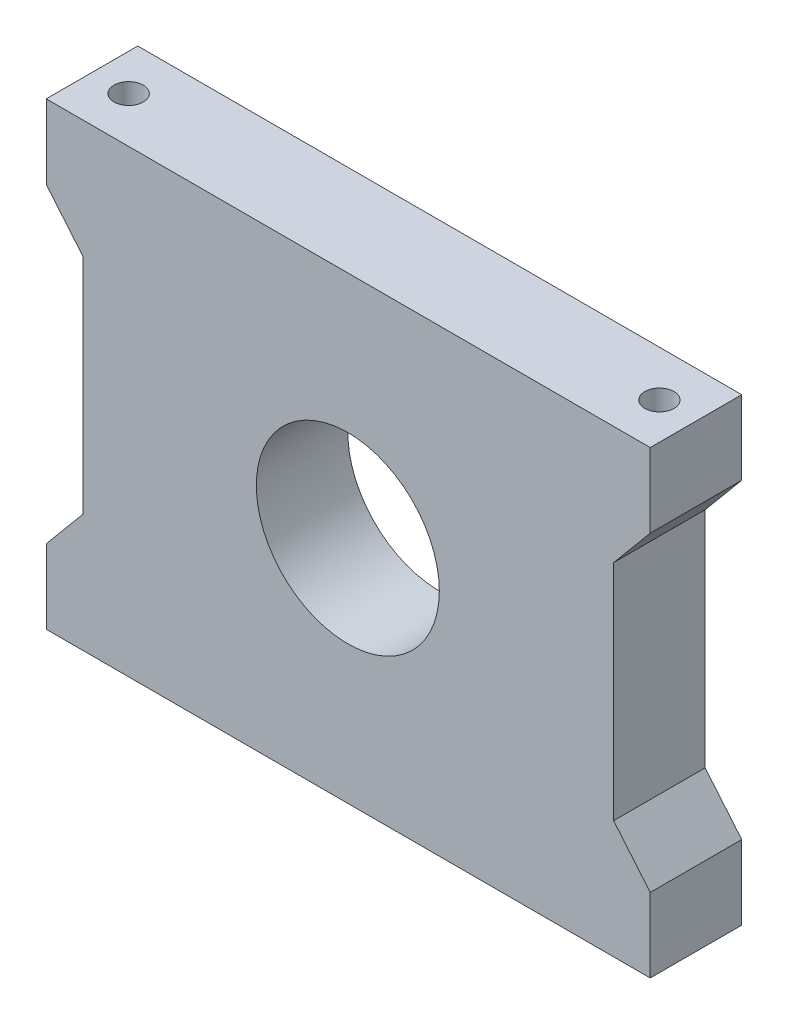
ISO-10303-21;
HEADER;
FILE_DESCRIPTION(('STEP AP214'),'2;1');
FILE_NAME('part.step','',(''),(''),'','','');
FILE_SCHEMA(('AUTOMOTIVE_DESIGN { 1 0 10303 214 1 1 1 1 }'));
ENDSEC;
DATA;
#1=APPLICATION_CONTEXT('core data for automotive mechanical design processes');
#2=APPLICATION_PROTOCOL_DEFINITION('international standard','automotive_design',2000,#1);
#3=PRODUCT_CONTEXT('',#1,'mechanical');
#4=PRODUCT('Part','Part','',(#3));
#5=PRODUCT_RELATED_PRODUCT_CATEGORY('part','',(#4));
#6=PRODUCT_DEFINITION_FORMATION('','',#4);
#7=PRODUCT_DEFINITION_CONTEXT('part definition',#1,'design');
#8=PRODUCT_DEFINITION('design','',#6,#7);
#9=PRODUCT_DEFINITION_SHAPE('','',#8);
#10=(LENGTH_UNIT() NAMED_UNIT(*) SI_UNIT(.MILLI.,.METRE.));
#11=(NAMED_UNIT(*) PLANE_ANGLE_UNIT() SI_UNIT($,.RADIAN.));
#12=(NAMED_UNIT(*) SI_UNIT($,.STERADIAN.) SOLID_ANGLE_UNIT());
#13=UNCERTAINTY_MEASURE_WITH_UNIT(LENGTH_MEASURE(1.E-05),#10,'distance_accuracy_value','');
#14=(GEOMETRIC_REPRESENTATION_CONTEXT(3) GLOBAL_UNCERTAINTY_ASSIGNED_CONTEXT((#13)) GLOBAL_UNIT_ASSIGNED_CONTEXT((#10,
#11,#12)) REPRESENTATION_CONTEXT('',''));
#15=CARTESIAN_POINT('',(0.,0.,0.));
#16=DIRECTION('',(0.,0.,1.));
#17=DIRECTION('',(1.,0.,0.));
#18=AXIS2_PLACEMENT_3D('',#15,#16,#17);
#19=CARTESIAN_POINT('',(0.,0.,10.));
#20=DIRECTION('',(0.,0.,1.));
#21=DIRECTION('',(1.,0.,0.));
#22=AXIS2_PLACEMENT_3D('',#19,#20,#21);
#23=PLANE('',#22);
#24=DIRECTION('',(0.,-1.,0.));
#25=VECTOR('',#24,1.);
#26=CARTESIAN_POINT('',(0.,0.,10.));
#27=LINE('',#26,#25);
#28=CARTESIAN_POINT('',(0.,8.1,10.));
#29=VERTEX_POINT('',#28);
#30=CARTESIAN_POINT('',(0.,0.,10.));
#31=VERTEX_POINT('',#30);
#32=EDGE_CURVE('E184',#29,#31,#27,.T.);
#33=ORIENTED_EDGE('',*,*,#32,.T.);
#34=DIRECTION('',(1.,0.,0.));
#35=VECTOR('',#34,1.);
#36=CARTESIAN_POINT('',(0.,0.,10.));
#37=LINE('',#36,#35);
#38=CARTESIAN_POINT('',(66.,0.,10.));
#39=VERTEX_POINT('',#38);
#40=EDGE_CURVE('E112',#31,#39,#37,.T.);
#41=ORIENTED_EDGE('',*,*,#40,.T.);
#42=DIRECTION('',(0.,1.,0.));
#43=VECTOR('',#42,1.);
#44=CARTESIAN_POINT('',(66.,0.,10.));
#45=LINE('',#44,#43);
#46=CARTESIAN_POINT('',(66.,8.1,10.));
#47=VERTEX_POINT('',#46);
#48=EDGE_CURVE('E211',#39,#47,#45,.T.);
#49=ORIENTED_EDGE('',*,*,#48,.T.);
#50=DIRECTION('',(-0.641215926832567,0.767360498837576,0.));
#51=VECTOR('',#50,1.);
#52=CARTESIAN_POINT('',(66.,8.1,10.));
#53=LINE('',#52,#51);
#54=CARTESIAN_POINT('',(62.,12.8869085387703,10.));
#55=VERTEX_POINT('',#54);
#56=EDGE_CURVE('E230',#47,#55,#53,.T.);
#57=ORIENTED_EDGE('',*,*,#56,.T.);
#58=DIRECTION('',(0.,1.,0.));
#59=VECTOR('',#58,1.);
#60=CARTESIAN_POINT('',(62.,12.8869085387703,10.));
#61=LINE('',#60,#59);
#62=CARTESIAN_POINT('',(62.,37.3130914612297,10.));
#63=VERTEX_POINT('',#62);
#64=EDGE_CURVE('E227',#55,#63,#61,.T.);
#65=ORIENTED_EDGE('',*,*,#64,.T.);
#66=DIRECTION('',(0.641215926832567,0.767360498837575,0.));
#67=VECTOR('',#66,1.);
#68=CARTESIAN_POINT('',(66.,42.1,10.));
#69=LINE('',#68,#67);
#70=CARTESIAN_POINT('',(66.,42.1,10.));
#71=VERTEX_POINT('',#70);
#72=EDGE_CURVE('E229',#63,#71,#69,.T.);
#73=ORIENTED_EDGE('',*,*,#72,.T.);
#74=DIRECTION('',(0.,1.,0.));
#75=VECTOR('',#74,1.);
#76=CARTESIAN_POINT('',(66.,50.2,10.));
#77=LINE('',#76,#75);
#78=CARTESIAN_POINT('',(66.,50.2,10.));
#79=VERTEX_POINT('',#78);
#80=EDGE_CURVE('E232',#71,#79,#77,.T.);
#81=ORIENTED_EDGE('',*,*,#80,.T.);
#82=DIRECTION('',(-1.,0.,0.));
#83=VECTOR('',#82,1.);
#84=CARTESIAN_POINT('',(66.,50.2,10.));
#85=LINE('',#84,#83);
#86=CARTESIAN_POINT('',(0.,50.2,10.));
#87=VERTEX_POINT('',#86);
#88=EDGE_CURVE('E238',#79,#87,#85,.T.);
#89=ORIENTED_EDGE('',*,*,#88,.T.);
#90=DIRECTION('',(0.,-1.,0.));
#91=VECTOR('',#90,1.);
#92=CARTESIAN_POINT('',(0.,50.2,10.));
#93=LINE('',#92,#91);
#94=CARTESIAN_POINT('',(0.,42.1,10.));
#95=VERTEX_POINT('',#94);
#96=EDGE_CURVE('E143',#87,#95,#93,.T.);
#97=ORIENTED_EDGE('',*,*,#96,.T.);
#98=DIRECTION('',(0.641215926832567,-0.767360498837575,0.));
#99=VECTOR('',#98,1.);
#100=CARTESIAN_POINT('',(0.,42.1,10.));
#101=LINE('',#100,#99);
#102=CARTESIAN_POINT('',(4.,37.3130914612297,10.));
#103=VERTEX_POINT('',#102);
#104=EDGE_CURVE('E137',#95,#103,#101,.T.);
#105=ORIENTED_EDGE('',*,*,#104,.T.);
#106=DIRECTION('',(0.,-1.,0.));
#107=VECTOR('',#106,1.);
#108=CARTESIAN_POINT('',(4.,12.8869085387703,10.));
#109=LINE('',#108,#107);
#110=CARTESIAN_POINT('',(4.,12.8869085387703,10.));
#111=VERTEX_POINT('',#110);
#112=EDGE_CURVE('E141',#103,#111,#109,.T.);
#113=ORIENTED_EDGE('',*,*,#112,.T.);
#114=DIRECTION('',(-0.641215926832567,-0.767360498837575,0.));
#115=VECTOR('',#114,1.);
#116=CARTESIAN_POINT('',(0.,8.1,10.));
#117=LINE('',#116,#115);
#118=EDGE_CURVE('E57',#111,#29,#117,.T.);
#119=ORIENTED_EDGE('',*,*,#118,.T.);
#120=EDGE_LOOP('',(#33,#41,#49,#57,#65,#73,#81,#89,#97,#105,#113,#119));
#121=FACE_BOUND('',#120,.T.);
#122=CARTESIAN_POINT('',(32.9524080393924,25.1,10.));
#123=DIRECTION('',(0.,0.,1.));
#124=DIRECTION('',(1.,0.,0.));
#125=AXIS2_PLACEMENT_3D('',#122,#123,#124);
#126=CIRCLE('',#125,10.);
#127=CARTESIAN_POINT('',(42.9524080393924,25.1,10.));
#128=VERTEX_POINT('',#127);
#129=EDGE_CURVE('E165',#128,#128,#126,.T.);
#130=ORIENTED_EDGE('',*,*,#129,.F.);
#131=EDGE_LOOP('',(#130));
#132=FACE_BOUND('',#131,.T.);
#133=ADVANCED_FACE('F40',(#121,#132),#23,.T.);
#134=CARTESIAN_POINT('',(0.,0.,0.));
#135=DIRECTION('',(0.,0.,1.));
#136=DIRECTION('',(1.,0.,0.));
#137=AXIS2_PLACEMENT_3D('',#134,#135,#136);
#138=PLANE('',#137);
#139=DIRECTION('',(0.,-1.,0.));
#140=VECTOR('',#139,1.);
#141=CARTESIAN_POINT('',(0.,0.,0.));
#142=LINE('',#141,#140);
#143=CARTESIAN_POINT('',(0.,8.1,0.));
#144=VERTEX_POINT('',#143);
#145=CARTESIAN_POINT('',(0.,0.,0.));
#146=VERTEX_POINT('',#145);
#147=EDGE_CURVE('E161',#144,#146,#142,.T.);
#148=ORIENTED_EDGE('',*,*,#147,.F.);
#149=DIRECTION('',(-0.641215926832567,-0.767360498837575,0.));
#150=VECTOR('',#149,1.);
#151=CARTESIAN_POINT('',(0.,8.1,0.));
#152=LINE('',#151,#150);
#153=CARTESIAN_POINT('',(4.,12.8869085387703,0.));
#154=VERTEX_POINT('',#153);
#155=EDGE_CURVE('E104',#154,#144,#152,.T.);
#156=ORIENTED_EDGE('',*,*,#155,.F.);
#157=DIRECTION('',(0.,-1.,0.));
#158=VECTOR('',#157,1.);
#159=CARTESIAN_POINT('',(4.,12.8869085387703,0.));
#160=LINE('',#159,#158);
#161=CARTESIAN_POINT('',(4.,37.3130914612297,0.));
#162=VERTEX_POINT('',#161);
#163=EDGE_CURVE('E98',#162,#154,#160,.T.);
#164=ORIENTED_EDGE('',*,*,#163,.F.);
#165=DIRECTION('',(0.641215926832567,-0.767360498837575,0.));
#166=VECTOR('',#165,1.);
#167=CARTESIAN_POINT('',(0.,42.1,0.));
#168=LINE('',#167,#166);
#169=CARTESIAN_POINT('',(0.,42.1,0.));
#170=VERTEX_POINT('',#169);
#171=EDGE_CURVE('E151',#170,#162,#168,.T.);
#172=ORIENTED_EDGE('',*,*,#171,.F.);
#173=DIRECTION('',(0.,-1.,0.));
#174=VECTOR('',#173,1.);
#175=CARTESIAN_POINT('',(0.,50.2,0.));
#176=LINE('',#175,#174);
#177=CARTESIAN_POINT('',(0.,50.2,0.));
#178=VERTEX_POINT('',#177);
#179=EDGE_CURVE('E179',#178,#170,#176,.T.);
#180=ORIENTED_EDGE('',*,*,#179,.F.);
#181=DIRECTION('',(-1.,0.,0.));
#182=VECTOR('',#181,1.);
#183=CARTESIAN_POINT('',(66.,50.2,0.));
#184=LINE('',#183,#182);
#185=CARTESIAN_POINT('',(66.,50.2,0.));
#186=VERTEX_POINT('',#185);
#187=EDGE_CURVE('E177',#186,#178,#184,.T.);
#188=ORIENTED_EDGE('',*,*,#187,.F.);
#189=DIRECTION('',(0.,1.,0.));
#190=VECTOR('',#189,1.);
#191=CARTESIAN_POINT('',(66.,50.2,0.));
#192=LINE('',#191,#190);
#193=CARTESIAN_POINT('',(66.,42.1,0.));
#194=VERTEX_POINT('',#193);
#195=EDGE_CURVE('E175',#194,#186,#192,.T.);
#196=ORIENTED_EDGE('',*,*,#195,.F.);
#197=DIRECTION('',(0.641215926832567,0.767360498837575,0.));
#198=VECTOR('',#197,1.);
#199=CARTESIAN_POINT('',(66.,42.1,0.));
#200=LINE('',#199,#198);
#201=CARTESIAN_POINT('',(62.,37.3130914612297,0.));
#202=VERTEX_POINT('',#201);
#203=EDGE_CURVE('E173',#202,#194,#200,.T.);
#204=ORIENTED_EDGE('',*,*,#203,.F.);
#205=DIRECTION('',(0.,1.,0.));
#206=VECTOR('',#205,1.);
#207=CARTESIAN_POINT('',(62.,12.8869085387703,0.));
#208=LINE('',#207,#206);
#209=CARTESIAN_POINT('',(62.,12.8869085387703,0.));
#210=VERTEX_POINT('',#209);
#211=EDGE_CURVE('E171',#210,#202,#208,.T.);
#212=ORIENTED_EDGE('',*,*,#211,.F.);
#213=DIRECTION('',(-0.641215926832567,0.767360498837576,0.));
#214=VECTOR('',#213,1.);
#215=CARTESIAN_POINT('',(66.,8.1,0.));
#216=LINE('',#215,#214);
#217=CARTESIAN_POINT('',(66.,8.1,0.));
#218=VERTEX_POINT('',#217);
#219=EDGE_CURVE('E169',#218,#210,#216,.T.);
#220=ORIENTED_EDGE('',*,*,#219,.F.);
#221=DIRECTION('',(0.,1.,0.));
#222=VECTOR('',#221,1.);
#223=CARTESIAN_POINT('',(66.,0.,0.));
#224=LINE('',#223,#222);
#225=CARTESIAN_POINT('',(66.,0.,0.));
#226=VERTEX_POINT('',#225);
#227=EDGE_CURVE('E167',#226,#218,#224,.T.);
#228=ORIENTED_EDGE('',*,*,#227,.F.);
#229=DIRECTION('',(1.,0.,0.));
#230=VECTOR('',#229,1.);
#231=CARTESIAN_POINT('',(0.,0.,0.));
#232=LINE('',#231,#230);
#233=EDGE_CURVE('E164',#146,#226,#232,.T.);
#234=ORIENTED_EDGE('',*,*,#233,.F.);
#235=EDGE_LOOP('',(#148,#156,#164,#172,#180,#188,#196,#204,#212,#220,#228,#234));
#236=FACE_BOUND('',#235,.T.);
#237=CARTESIAN_POINT('',(32.9524080393924,25.1,0.));
#238=DIRECTION('',(0.,0.,1.));
#239=DIRECTION('',(1.,0.,0.));
#240=AXIS2_PLACEMENT_3D('',#237,#238,#239);
#241=CIRCLE('',#240,10.);
#242=CARTESIAN_POINT('',(42.9524080393924,25.1,0.));
#243=VERTEX_POINT('',#242);
#244=EDGE_CURVE('E324',#243,#243,#241,.T.);
#245=ORIENTED_EDGE('',*,*,#244,.T.);
#246=EDGE_LOOP('',(#245));
#247=FACE_BOUND('',#246,.T.);
#248=ADVANCED_FACE('F215',(#236,#247),#138,.F.);
#249=CARTESIAN_POINT('',(0.,0.,10.));
#250=DIRECTION('',(1.,0.,0.));
#251=DIRECTION('',(0.,0.,-1.));
#252=AXIS2_PLACEMENT_3D('',#249,#250,#251);
#253=PLANE('',#252);
#254=ORIENTED_EDGE('',*,*,#147,.T.);
#255=DIRECTION('',(0.,0.,-1.));
#256=VECTOR('',#255,1.);
#257=CARTESIAN_POINT('',(0.,0.,10.));
#258=LINE('',#257,#256);
#259=EDGE_CURVE('E11',#31,#146,#258,.T.);
#260=ORIENTED_EDGE('',*,*,#259,.F.);
#261=ORIENTED_EDGE('',*,*,#32,.F.);
#262=DIRECTION('',(0.,0.,-1.));
#263=VECTOR('',#262,1.);
#264=CARTESIAN_POINT('',(0.,8.1,10.));
#265=LINE('',#264,#263);
#266=EDGE_CURVE('E157',#29,#144,#265,.T.);
#267=ORIENTED_EDGE('',*,*,#266,.T.);
#268=EDGE_LOOP('',(#254,#260,#261,#267));
#269=FACE_BOUND('',#268,.T.);
#270=ADVANCED_FACE('F42',(#269),#253,.F.);
#271=CARTESIAN_POINT('',(0.,0.,10.));
#272=DIRECTION('',(0.,1.,0.));
#273=DIRECTION('',(0.,0.,1.));
#274=AXIS2_PLACEMENT_3D('',#271,#272,#273);
#275=PLANE('',#274);
#276=CARTESIAN_POINT('',(4.,0.,5.));
#277=DIRECTION('',(0.,1.,0.));
#278=DIRECTION('',(0.,0.,1.));
#279=AXIS2_PLACEMENT_3D('',#276,#277,#278);
#280=CIRCLE('',#279,1.6);
#281=CARTESIAN_POINT('',(4.,0.,6.6));
#282=VERTEX_POINT('',#281);
#283=EDGE_CURVE('E307',#282,#282,#280,.T.);
#284=ORIENTED_EDGE('',*,*,#283,.T.);
#285=EDGE_LOOP('',(#284));
#286=FACE_BOUND('',#285,.T.);
#287=CARTESIAN_POINT('',(62.,0.,4.99999999999999));
#288=DIRECTION('',(0.,1.,0.));
#289=DIRECTION('',(0.,0.,-1.));
#290=AXIS2_PLACEMENT_3D('',#287,#288,#289);
#291=CIRCLE('',#290,1.60000000000001);
#292=CARTESIAN_POINT('',(62.,0.,3.39999999999999));
#293=VERTEX_POINT('',#292);
#294=EDGE_CURVE('E318',#293,#293,#291,.T.);
#295=ORIENTED_EDGE('',*,*,#294,.T.);
#296=EDGE_LOOP('',(#295));
#297=FACE_BOUND('',#296,.T.);
#298=ORIENTED_EDGE('',*,*,#233,.T.);
#299=DIRECTION('',(0.,0.,-1.));
#300=VECTOR('',#299,1.);
#301=CARTESIAN_POINT('',(66.,0.,10.));
#302=LINE('',#301,#300);
#303=EDGE_CURVE('E49',#39,#226,#302,.T.);
#304=ORIENTED_EDGE('',*,*,#303,.F.);
#305=ORIENTED_EDGE('',*,*,#40,.F.);
#306=ORIENTED_EDGE('',*,*,#259,.T.);
#307=EDGE_LOOP('',(#298,#304,#305,#306));
#308=FACE_BOUND('',#307,.T.);
#309=ADVANCED_FACE('F365',(#286,#297,#308),#275,.F.);
#310=CARTESIAN_POINT('',(66.,0.,10.));
#311=DIRECTION('',(-1.,0.,0.));
#312=DIRECTION('',(0.,0.,1.));
#313=AXIS2_PLACEMENT_3D('',#310,#311,#312);
#314=PLANE('',#313);
#315=ORIENTED_EDGE('',*,*,#227,.T.);
#316=DIRECTION('',(0.,0.,-1.));
#317=VECTOR('',#316,1.);
#318=CARTESIAN_POINT('',(66.,8.1,10.));
#319=LINE('',#318,#317);
#320=EDGE_CURVE('E203',#47,#218,#319,.T.);
#321=ORIENTED_EDGE('',*,*,#320,.F.);
#322=ORIENTED_EDGE('',*,*,#48,.F.);
#323=ORIENTED_EDGE('',*,*,#303,.T.);
#324=EDGE_LOOP('',(#315,#321,#322,#323));
#325=FACE_BOUND('',#324,.T.);
#326=ADVANCED_FACE('F209',(#325),#314,.F.);
#327=CARTESIAN_POINT('',(66.,8.1,10.));
#328=DIRECTION('',(-0.767360498837576,-0.641215926832567,0.));
#329=DIRECTION('',(0.641215926832567,-0.767360498837576,0.));
#330=AXIS2_PLACEMENT_3D('',#327,#328,#329);
#331=PLANE('',#330);
#332=ORIENTED_EDGE('',*,*,#219,.T.);
#333=DIRECTION('',(0.,0.,-1.));
#334=VECTOR('',#333,1.);
#335=CARTESIAN_POINT('',(62.,12.8869085387703,10.));
#336=LINE('',#335,#334);
#337=EDGE_CURVE('E200',#55,#210,#336,.T.);
#338=ORIENTED_EDGE('',*,*,#337,.F.);
#339=ORIENTED_EDGE('',*,*,#56,.F.);
#340=ORIENTED_EDGE('',*,*,#320,.T.);
#341=EDGE_LOOP('',(#332,#338,#339,#340));
#342=FACE_BOUND('',#341,.T.);
#343=ADVANCED_FACE('F221',(#342),#331,.F.);
#344=CARTESIAN_POINT('',(62.,12.8869085387703,10.));
#345=DIRECTION('',(-1.,0.,0.));
#346=DIRECTION('',(0.,0.,1.));
#347=AXIS2_PLACEMENT_3D('',#344,#345,#346);
#348=PLANE('',#347);
#349=ORIENTED_EDGE('',*,*,#211,.T.);
#350=DIRECTION('',(0.,0.,-1.));
#351=VECTOR('',#350,1.);
#352=CARTESIAN_POINT('',(62.,37.3130914612297,10.));
#353=LINE('',#352,#351);
#354=EDGE_CURVE('E197',#63,#202,#353,.T.);
#355=ORIENTED_EDGE('',*,*,#354,.F.);
#356=ORIENTED_EDGE('',*,*,#64,.F.);
#357=ORIENTED_EDGE('',*,*,#337,.T.);
#358=EDGE_LOOP('',(#349,#355,#356,#357));
#359=FACE_BOUND('',#358,.T.);
#360=ADVANCED_FACE('F225',(#359),#348,.F.);
#361=CARTESIAN_POINT('',(66.,42.1,10.));
#362=DIRECTION('',(-0.767360498837575,0.641215926832567,0.));
#363=DIRECTION('',(-0.641215926832567,-0.767360498837575,0.));
#364=AXIS2_PLACEMENT_3D('',#361,#362,#363);
#365=PLANE('',#364);
#366=ORIENTED_EDGE('',*,*,#203,.T.);
#367=DIRECTION('',(0.,0.,-1.));
#368=VECTOR('',#367,1.);
#369=CARTESIAN_POINT('',(66.,42.1,10.));
#370=LINE('',#369,#368);
#371=EDGE_CURVE('E194',#71,#194,#370,.T.);
#372=ORIENTED_EDGE('',*,*,#371,.F.);
#373=ORIENTED_EDGE('',*,*,#72,.F.);
#374=ORIENTED_EDGE('',*,*,#354,.T.);
#375=EDGE_LOOP('',(#366,#372,#373,#374));
#376=FACE_BOUND('',#375,.T.);
#377=ADVANCED_FACE('F351',(#376),#365,.F.);
#378=CARTESIAN_POINT('',(66.,50.2,10.));
#379=DIRECTION('',(-1.,0.,0.));
#380=DIRECTION('',(0.,0.,1.));
#381=AXIS2_PLACEMENT_3D('',#378,#379,#380);
#382=PLANE('',#381);
#383=ORIENTED_EDGE('',*,*,#195,.T.);
#384=DIRECTION('',(0.,0.,-1.));
#385=VECTOR('',#384,1.);
#386=CARTESIAN_POINT('',(66.,50.2,10.));
#387=LINE('',#386,#385);
#388=EDGE_CURVE('E191',#79,#186,#387,.T.);
#389=ORIENTED_EDGE('',*,*,#388,.F.);
#390=ORIENTED_EDGE('',*,*,#80,.F.);
#391=ORIENTED_EDGE('',*,*,#371,.T.);
#392=EDGE_LOOP('',(#383,#389,#390,#391));
#393=FACE_BOUND('',#392,.T.);
#394=ADVANCED_FACE('F343',(#393),#382,.F.);
#395=CARTESIAN_POINT('',(66.,50.2,10.));
#396=DIRECTION('',(0.,-1.,0.));
#397=DIRECTION('',(0.,0.,-1.));
#398=AXIS2_PLACEMENT_3D('',#395,#396,#397);
#399=PLANE('',#398);
#400=CARTESIAN_POINT('',(4.,50.2,5.));
#401=DIRECTION('',(0.,1.,0.));
#402=DIRECTION('',(0.,0.,1.));
#403=AXIS2_PLACEMENT_3D('',#400,#401,#402);
#404=CIRCLE('',#403,1.6);
#405=CARTESIAN_POINT('',(4.,50.2,6.6));
#406=VERTEX_POINT('',#405);
#407=EDGE_CURVE('E325',#406,#406,#404,.T.);
#408=ORIENTED_EDGE('',*,*,#407,.F.);
#409=EDGE_LOOP('',(#408));
#410=FACE_BOUND('',#409,.T.);
#411=CARTESIAN_POINT('',(62.,50.2,4.99999999999999));
#412=DIRECTION('',(0.,1.,0.));
#413=DIRECTION('',(0.,0.,-1.));
#414=AXIS2_PLACEMENT_3D('',#411,#412,#413);
#415=CIRCLE('',#414,1.60000000000001);
#416=CARTESIAN_POINT('',(62.,50.2,3.39999999999999));
#417=VERTEX_POINT('',#416);
#418=EDGE_CURVE('E306',#417,#417,#415,.T.);
#419=ORIENTED_EDGE('',*,*,#418,.F.);
#420=EDGE_LOOP('',(#419));
#421=FACE_BOUND('',#420,.T.);
#422=ORIENTED_EDGE('',*,*,#187,.T.);
#423=DIRECTION('',(0.,0.,-1.));
#424=VECTOR('',#423,1.);
#425=CARTESIAN_POINT('',(0.,50.2,10.));
#426=LINE('',#425,#424);
#427=EDGE_CURVE('E188',#87,#178,#426,.T.);
#428=ORIENTED_EDGE('',*,*,#427,.F.);
#429=ORIENTED_EDGE('',*,*,#88,.F.);
#430=ORIENTED_EDGE('',*,*,#388,.T.);
#431=EDGE_LOOP('',(#422,#428,#429,#430));
#432=FACE_BOUND('',#431,.T.);
#433=ADVANCED_FACE('F244',(#410,#421,#432),#399,.F.);
#434=CARTESIAN_POINT('',(0.,50.2,10.));
#435=DIRECTION('',(1.,0.,0.));
#436=DIRECTION('',(0.,0.,-1.));
#437=AXIS2_PLACEMENT_3D('',#434,#435,#436);
#438=PLANE('',#437);
#439=ORIENTED_EDGE('',*,*,#179,.T.);
#440=DIRECTION('',(0.,0.,-1.));
#441=VECTOR('',#440,1.);
#442=CARTESIAN_POINT('',(0.,42.1,10.));
#443=LINE('',#442,#441);
#444=EDGE_CURVE('E152',#95,#170,#443,.T.);
#445=ORIENTED_EDGE('',*,*,#444,.F.);
#446=ORIENTED_EDGE('',*,*,#96,.F.);
#447=ORIENTED_EDGE('',*,*,#427,.T.);
#448=EDGE_LOOP('',(#439,#445,#446,#447));
#449=FACE_BOUND('',#448,.T.);
#450=ADVANCED_FACE('F248',(#449),#438,.F.);
#451=CARTESIAN_POINT('',(0.,42.1,10.));
#452=DIRECTION('',(0.767360498837575,0.641215926832567,0.));
#453=DIRECTION('',(-0.641215926832567,0.767360498837575,0.));
#454=AXIS2_PLACEMENT_3D('',#451,#452,#453);
#455=PLANE('',#454);
#456=ORIENTED_EDGE('',*,*,#171,.T.);
#457=DIRECTION('',(0.,0.,-1.));
#458=VECTOR('',#457,1.);
#459=CARTESIAN_POINT('',(4.,37.3130914612297,10.));
#460=LINE('',#459,#458);
#461=EDGE_CURVE('E148',#103,#162,#460,.T.);
#462=ORIENTED_EDGE('',*,*,#461,.F.);
#463=ORIENTED_EDGE('',*,*,#104,.F.);
#464=ORIENTED_EDGE('',*,*,#444,.T.);
#465=EDGE_LOOP('',(#456,#462,#463,#464));
#466=FACE_BOUND('',#465,.T.);
#467=ADVANCED_FACE('F149',(#466),#455,.F.);
#468=CARTESIAN_POINT('',(4.,12.8869085387703,10.));
#469=DIRECTION('',(1.,0.,0.));
#470=DIRECTION('',(0.,0.,-1.));
#471=AXIS2_PLACEMENT_3D('',#468,#469,#470);
#472=PLANE('',#471);
#473=ORIENTED_EDGE('',*,*,#163,.T.);
#474=DIRECTION('',(0.,0.,-1.));
#475=VECTOR('',#474,1.);
#476=CARTESIAN_POINT('',(4.,12.8869085387703,10.));
#477=LINE('',#476,#475);
#478=EDGE_CURVE('E153',#111,#154,#477,.T.);
#479=ORIENTED_EDGE('',*,*,#478,.F.);
#480=ORIENTED_EDGE('',*,*,#112,.F.);
#481=ORIENTED_EDGE('',*,*,#461,.T.);
#482=EDGE_LOOP('',(#473,#479,#480,#481));
#483=FACE_BOUND('',#482,.T.);
#484=ADVANCED_FACE('F155',(#483),#472,.F.);
#485=CARTESIAN_POINT('',(0.,8.1,10.));
#486=DIRECTION('',(0.767360498837575,-0.641215926832567,0.));
#487=DIRECTION('',(0.641215926832567,0.767360498837575,0.));
#488=AXIS2_PLACEMENT_3D('',#485,#486,#487);
#489=PLANE('',#488);
#490=ORIENTED_EDGE('',*,*,#155,.T.);
#491=ORIENTED_EDGE('',*,*,#266,.F.);
#492=ORIENTED_EDGE('',*,*,#118,.F.);
#493=ORIENTED_EDGE('',*,*,#478,.T.);
#494=EDGE_LOOP('',(#490,#491,#492,#493));
#495=FACE_BOUND('',#494,.T.);
#496=ADVANCED_FACE('F252',(#495),#489,.F.);
#497=CARTESIAN_POINT('',(32.9524080393924,25.1,10.));
#498=DIRECTION('',(0.,0.,-1.));
#499=DIRECTION('',(-1.,0.,0.));
#500=AXIS2_PLACEMENT_3D('',#497,#498,#499);
#501=CYLINDRICAL_SURFACE('',#500,10.);
#502=ORIENTED_EDGE('',*,*,#129,.T.);
#503=EDGE_LOOP('',(#502));
#504=FACE_BOUND('',#503,.T.);
#505=ORIENTED_EDGE('',*,*,#244,.F.);
#506=EDGE_LOOP('',(#505));
#507=FACE_BOUND('',#506,.T.);
#508=ADVANCED_FACE('F254',(#504,#507),#501,.F.);
#509=CARTESIAN_POINT('',(62.,40.2,4.99999999999999));
#510=DIRECTION('',(0.,1.,0.));
#511=DIRECTION('',(0.,0.,1.));
#512=AXIS2_PLACEMENT_3D('',#509,#510,#511);
#513=CYLINDRICAL_SURFACE('',#512,1.60000000000001);
#514=CARTESIAN_POINT('',(62.,40.2,4.99999999999999));
#515=DIRECTION('',(0.,1.,0.));
#516=DIRECTION('',(0.,0.,-1.));
#517=AXIS2_PLACEMENT_3D('',#514,#515,#516);
#518=CIRCLE('',#517,1.60000000000001);
#519=CARTESIAN_POINT('',(62.,40.2,3.39999999999999));
#520=VERTEX_POINT('',#519);
#521=EDGE_CURVE('E310',#520,#520,#518,.T.);
#522=ORIENTED_EDGE('',*,*,#521,.F.);
#523=EDGE_LOOP('',(#522));
#524=FACE_BOUND('',#523,.T.);
#525=ORIENTED_EDGE('',*,*,#418,.T.);
#526=EDGE_LOOP('',(#525));
#527=FACE_BOUND('',#526,.T.);
#528=ADVANCED_FACE('F260',(#524,#527),#513,.F.);
#529=CARTESIAN_POINT('',(62.,40.2,4.99999999999999));
#530=DIRECTION('',(0.,-1.,0.));
#531=DIRECTION('',(0.,0.,-1.));
#532=AXIS2_PLACEMENT_3D('',#529,#530,#531);
#533=PLANE('',#532);
#534=ORIENTED_EDGE('',*,*,#521,.T.);
#535=EDGE_LOOP('',(#534));
#536=FACE_BOUND('',#535,.T.);
#537=ADVANCED_FACE('F273',(#536),#533,.F.);
#538=CARTESIAN_POINT('',(4.,40.2,5.));
#539=DIRECTION('',(0.,1.,0.));
#540=DIRECTION('',(0.,0.,1.));
#541=AXIS2_PLACEMENT_3D('',#538,#539,#540);
#542=CYLINDRICAL_SURFACE('',#541,1.6);
#543=CARTESIAN_POINT('',(4.,40.2,5.));
#544=DIRECTION('',(0.,1.,0.));
#545=DIRECTION('',(0.,0.,1.));
#546=AXIS2_PLACEMENT_3D('',#543,#544,#545);
#547=CIRCLE('',#546,1.6);
#548=CARTESIAN_POINT('',(4.,40.2,6.6));
#549=VERTEX_POINT('',#548);
#550=EDGE_CURVE('E321',#549,#549,#547,.T.);
#551=ORIENTED_EDGE('',*,*,#550,.F.);
#552=EDGE_LOOP('',(#551));
#553=FACE_BOUND('',#552,.T.);
#554=ORIENTED_EDGE('',*,*,#407,.T.);
#555=EDGE_LOOP('',(#554));
#556=FACE_BOUND('',#555,.T.);
#557=ADVANCED_FACE('F277',(#553,#556),#542,.F.);
#558=CARTESIAN_POINT('',(4.,40.2,5.));
#559=DIRECTION('',(0.,1.,0.));
#560=DIRECTION('',(0.,0.,1.));
#561=AXIS2_PLACEMENT_3D('',#558,#559,#560);
#562=PLANE('',#561);
#563=ORIENTED_EDGE('',*,*,#550,.T.);
#564=EDGE_LOOP('',(#563));
#565=FACE_BOUND('',#564,.T.);
#566=ADVANCED_FACE('F281',(#565),#562,.T.);
#567=CARTESIAN_POINT('',(62.,10.,4.99999999999999));
#568=DIRECTION('',(0.,-1.,0.));
#569=DIRECTION('',(0.,0.,-1.));
#570=AXIS2_PLACEMENT_3D('',#567,#568,#569);
#571=CYLINDRICAL_SURFACE('',#570,1.60000000000001);
#572=CARTESIAN_POINT('',(62.,10.,4.99999999999999));
#573=DIRECTION('',(0.,1.,0.));
#574=DIRECTION('',(0.,0.,-1.));
#575=AXIS2_PLACEMENT_3D('',#572,#573,#574);
#576=CIRCLE('',#575,1.60000000000001);
#577=CARTESIAN_POINT('',(62.,10.,3.39999999999999));
#578=VERTEX_POINT('',#577);
#579=EDGE_CURVE('E313',#578,#578,#576,.T.);
#580=ORIENTED_EDGE('',*,*,#579,.T.);
#581=EDGE_LOOP('',(#580));
#582=FACE_BOUND('',#581,.T.);
#583=ORIENTED_EDGE('',*,*,#294,.F.);
#584=EDGE_LOOP('',(#583));
#585=FACE_BOUND('',#584,.T.);
#586=ADVANCED_FACE('F285',(#582,#585),#571,.F.);
#587=CARTESIAN_POINT('',(62.,10.,4.99999999999999));
#588=DIRECTION('',(0.,1.,0.));
#589=DIRECTION('',(0.,0.,-1.));
#590=AXIS2_PLACEMENT_3D('',#587,#588,#589);
#591=PLANE('',#590);
#592=ORIENTED_EDGE('',*,*,#579,.F.);
#593=EDGE_LOOP('',(#592));
#594=FACE_BOUND('',#593,.T.);
#595=ADVANCED_FACE('F289',(#594),#591,.F.);
#596=CARTESIAN_POINT('',(4.,10.,5.));
#597=DIRECTION('',(0.,-1.,0.));
#598=DIRECTION('',(0.,0.,-1.));
#599=AXIS2_PLACEMENT_3D('',#596,#597,#598);
#600=CYLINDRICAL_SURFACE('',#599,1.6);
#601=CARTESIAN_POINT('',(4.,10.,5.));
#602=DIRECTION('',(0.,1.,0.));
#603=DIRECTION('',(0.,0.,1.));
#604=AXIS2_PLACEMENT_3D('',#601,#602,#603);
#605=CIRCLE('',#604,1.6);
#606=CARTESIAN_POINT('',(4.,10.,6.6));
#607=VERTEX_POINT('',#606);
#608=EDGE_CURVE('E305',#607,#607,#605,.T.);
#609=ORIENTED_EDGE('',*,*,#608,.T.);
#610=EDGE_LOOP('',(#609));
#611=FACE_BOUND('',#610,.T.);
#612=ORIENTED_EDGE('',*,*,#283,.F.);
#613=EDGE_LOOP('',(#612));
#614=FACE_BOUND('',#613,.T.);
#615=ADVANCED_FACE('F293',(#611,#614),#600,.F.);
#616=CARTESIAN_POINT('',(4.,10.,5.));
#617=DIRECTION('',(0.,-1.,0.));
#618=DIRECTION('',(0.,0.,1.));
#619=AXIS2_PLACEMENT_3D('',#616,#617,#618);
#620=PLANE('',#619);
#621=ORIENTED_EDGE('',*,*,#608,.F.);
#622=EDGE_LOOP('',(#621));
#623=FACE_BOUND('',#622,.T.);
#624=ADVANCED_FACE('F297',(#623),#620,.T.);
#625=CLOSED_SHELL('',(#133,#248,#270,#309,#326,#343,#360,#377,#394,#433,#450,#467,#484,#496,
#508,#528,#537,#557,#566,#586,#595,#615,#624));
#626=MANIFOLD_SOLID_BREP('B2',#625);
#627=ADVANCED_BREP_SHAPE_REPRESENTATION('',(#18,#626),#14);
#628=SHAPE_DEFINITION_REPRESENTATION(#9,#627);
ENDSEC;
END-ISO-10303-21;
